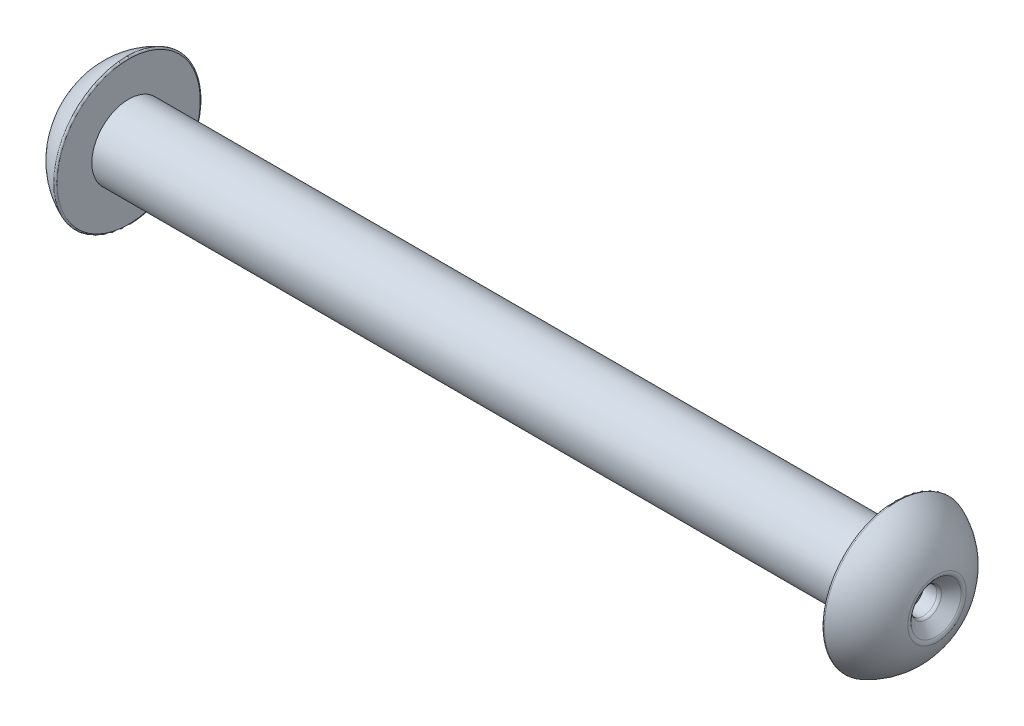
ISO-10303-21;
HEADER;
FILE_DESCRIPTION(('STEP AP214'),'2;1');
FILE_NAME('part.step','',(''),(''),'','','');
FILE_SCHEMA(('AUTOMOTIVE_DESIGN { 1 0 10303 214 1 1 1 1 }'));
ENDSEC;
DATA;
#1=APPLICATION_CONTEXT('core data for automotive mechanical design processes');
#2=APPLICATION_PROTOCOL_DEFINITION('international standard','automotive_design',2000,#1);
#3=PRODUCT_CONTEXT('',#1,'mechanical');
#4=PRODUCT('Part','Part','',(#3));
#5=PRODUCT_RELATED_PRODUCT_CATEGORY('part','',(#4));
#6=PRODUCT_DEFINITION_FORMATION('','',#4);
#7=PRODUCT_DEFINITION_CONTEXT('part definition',#1,'design');
#8=PRODUCT_DEFINITION('design','',#6,#7);
#9=PRODUCT_DEFINITION_SHAPE('','',#8);
#10=(LENGTH_UNIT() NAMED_UNIT(*) SI_UNIT(.MILLI.,.METRE.));
#11=(NAMED_UNIT(*) PLANE_ANGLE_UNIT() SI_UNIT($,.RADIAN.));
#12=(NAMED_UNIT(*) SI_UNIT($,.STERADIAN.) SOLID_ANGLE_UNIT());
#13=UNCERTAINTY_MEASURE_WITH_UNIT(LENGTH_MEASURE(1.E-05),#10,'distance_accuracy_value','');
#14=(GEOMETRIC_REPRESENTATION_CONTEXT(3) GLOBAL_UNCERTAINTY_ASSIGNED_CONTEXT((#13)) GLOBAL_UNIT_ASSIGNED_CONTEXT((#10,
#11,#12)) REPRESENTATION_CONTEXT('',''));
#15=CARTESIAN_POINT('',(0.,0.,0.));
#16=DIRECTION('',(0.,0.,1.));
#17=DIRECTION('',(1.,0.,0.));
#18=AXIS2_PLACEMENT_3D('',#15,#16,#17);
#19=CARTESIAN_POINT('',(1.5,0.,0.));
#20=DIRECTION('',(1.,0.,0.));
#21=DIRECTION('',(0.,0.,-1.));
#22=AXIS2_PLACEMENT_3D('',#19,#20,#21);
#23=DEGENERATE_TOROIDAL_SURFACE('',#22,0.757359312880715,4.5,.T.);
#24=CARTESIAN_POINT('',(-2.72723328863977,0.,0.));
#25=DIRECTION('',(1.,0.,0.));
#26=DIRECTION('',(0.,0.,-1.));
#27=AXIS2_PLACEMENT_3D('',#24,#25,#26);
#28=CIRCLE('',#27,2.30024580365565);
#29=CARTESIAN_POINT('',(-2.72723328863977,0.,-2.30024580365565));
#30=VERTEX_POINT('',#29);
#31=EDGE_CURVE('E53',#30,#30,#28,.T.);
#32=ORIENTED_EDGE('',*,*,#31,.T.);
#33=EDGE_LOOP('',(#32));
#34=FACE_BOUND('',#33,.T.);
#35=CARTESIAN_POINT('',(-0.136363636363636,0.,0.));
#36=DIRECTION('',(1.,0.,0.));
#37=DIRECTION('',(0.,0.,-1.));
#38=AXIS2_PLACEMENT_3D('',#35,#36,#37);
#39=CIRCLE('',#38,4.94929371713691);
#40=CARTESIAN_POINT('',(-0.136363636363636,0.,-4.94929371713691));
#41=VERTEX_POINT('',#40);
#42=EDGE_CURVE('E56',#41,#41,#39,.F.);
#43=ORIENTED_EDGE('',*,*,#42,.T.);
#44=EDGE_LOOP('',(#43));
#45=FACE_BOUND('',#44,.T.);
#46=ADVANCED_FACE('F39',(#34,#45),#23,.T.);
#47=CARTESIAN_POINT('',(52.,0.,0.));
#48=DIRECTION('',(-1.,0.,0.));
#49=DIRECTION('',(0.,0.,1.));
#50=AXIS2_PLACEMENT_3D('',#47,#48,#49);
#51=CYLINDRICAL_SURFACE('',#50,2.5);
#52=CARTESIAN_POINT('',(52.,0.,0.));
#53=DIRECTION('',(1.,0.,0.));
#54=DIRECTION('',(0.,0.,-1.));
#55=AXIS2_PLACEMENT_3D('',#52,#53,#54);
#56=CIRCLE('',#55,2.5);
#57=CARTESIAN_POINT('',(52.,0.,2.5));
#58=VERTEX_POINT('',#57);
#59=EDGE_CURVE('E84',#58,#58,#56,.T.);
#60=CARTESIAN_POINT('',(0.,0.,0.));
#61=DIRECTION('',(1.,0.,0.));
#62=DIRECTION('',(0.,0.,-1.));
#63=AXIS2_PLACEMENT_3D('',#60,#61,#62);
#64=CIRCLE('',#63,2.5);
#65=CARTESIAN_POINT('',(0.,0.,2.5));
#66=VERTEX_POINT('',#65);
#67=EDGE_CURVE('E81',#66,#66,#64,.T.);
#68=CARTESIAN_POINT('',(52.,0.,2.5));
#69=CARTESIAN_POINT('',(51.4583333333333,0.,2.5));
#70=CARTESIAN_POINT('',(50.9166666666667,0.,2.5));
#71=CARTESIAN_POINT('',(49.8333333333333,0.,2.5));
#72=CARTESIAN_POINT('',(49.2916666666667,0.,2.5));
#73=CARTESIAN_POINT('',(48.2083333333333,0.,2.5));
#74=CARTESIAN_POINT('',(47.6666666666667,0.,2.5));
#75=CARTESIAN_POINT('',(46.5833333333333,0.,2.5));
#76=CARTESIAN_POINT('',(46.0416666666667,0.,2.5));
#77=CARTESIAN_POINT('',(44.9583333333333,0.,2.5));
#78=CARTESIAN_POINT('',(44.4166666666667,0.,2.5));
#79=CARTESIAN_POINT('',(43.3333333333333,0.,2.5));
#80=CARTESIAN_POINT('',(42.7916666666667,0.,2.5));
#81=CARTESIAN_POINT('',(41.7083333333333,0.,2.5));
#82=CARTESIAN_POINT('',(41.1666666666667,0.,2.5));
#83=CARTESIAN_POINT('',(40.0833333333333,0.,2.5));
#84=CARTESIAN_POINT('',(39.5416666666667,0.,2.5));
#85=CARTESIAN_POINT('',(38.4583333333333,0.,2.5));
#86=CARTESIAN_POINT('',(37.9166666666667,0.,2.5));
#87=CARTESIAN_POINT('',(36.8333333333333,0.,2.5));
#88=CARTESIAN_POINT('',(36.2916666666667,0.,2.5));
#89=CARTESIAN_POINT('',(35.2083333333333,0.,2.5));
#90=CARTESIAN_POINT('',(34.6666666666667,0.,2.5));
#91=CARTESIAN_POINT('',(33.5833333333333,0.,2.5));
#92=CARTESIAN_POINT('',(33.0416666666667,0.,2.5));
#93=CARTESIAN_POINT('',(31.9583333333333,0.,2.5));
#94=CARTESIAN_POINT('',(31.4166666666667,0.,2.5));
#95=CARTESIAN_POINT('',(30.3333333333333,0.,2.5));
#96=CARTESIAN_POINT('',(29.7916666666667,0.,2.5));
#97=CARTESIAN_POINT('',(28.7083333333333,0.,2.5));
#98=CARTESIAN_POINT('',(28.1666666666667,0.,2.5));
#99=CARTESIAN_POINT('',(27.0833333333333,0.,2.5));
#100=CARTESIAN_POINT('',(26.5416666666667,0.,2.5));
#101=CARTESIAN_POINT('',(25.4583333333333,0.,2.5));
#102=CARTESIAN_POINT('',(24.9166666666667,0.,2.5));
#103=CARTESIAN_POINT('',(23.8333333333333,0.,2.5));
#104=CARTESIAN_POINT('',(23.2916666666667,0.,2.5));
#105=CARTESIAN_POINT('',(22.2083333333333,0.,2.5));
#106=CARTESIAN_POINT('',(21.6666666666667,0.,2.5));
#107=CARTESIAN_POINT('',(20.5833333333333,0.,2.5));
#108=CARTESIAN_POINT('',(20.0416666666667,0.,2.5));
#109=CARTESIAN_POINT('',(18.9583333333333,0.,2.5));
#110=CARTESIAN_POINT('',(18.4166666666667,0.,2.5));
#111=CARTESIAN_POINT('',(17.3333333333333,0.,2.5));
#112=CARTESIAN_POINT('',(16.7916666666667,0.,2.5));
#113=CARTESIAN_POINT('',(15.7083333333333,0.,2.5));
#114=CARTESIAN_POINT('',(15.1666666666667,0.,2.5));
#115=CARTESIAN_POINT('',(14.0833333333333,0.,2.5));
#116=CARTESIAN_POINT('',(13.5416666666667,0.,2.5));
#117=CARTESIAN_POINT('',(12.4583333333333,0.,2.5));
#118=CARTESIAN_POINT('',(11.9166666666667,0.,2.5));
#119=CARTESIAN_POINT('',(10.8333333333333,0.,2.5));
#120=CARTESIAN_POINT('',(10.2916666666667,0.,2.5));
#121=CARTESIAN_POINT('',(9.20833333333333,0.,2.5));
#122=CARTESIAN_POINT('',(8.66666666666667,0.,2.5));
#123=CARTESIAN_POINT('',(7.58333333333333,0.,2.5));
#124=CARTESIAN_POINT('',(7.04166666666667,0.,2.5));
#125=CARTESIAN_POINT('',(5.95833333333333,0.,2.5));
#126=CARTESIAN_POINT('',(5.41666666666667,0.,2.5));
#127=CARTESIAN_POINT('',(4.33333333333333,0.,2.5));
#128=CARTESIAN_POINT('',(3.79166666666667,0.,2.5));
#129=CARTESIAN_POINT('',(2.70833333333334,0.,2.5));
#130=CARTESIAN_POINT('',(2.16666666666667,0.,2.5));
#131=CARTESIAN_POINT('',(1.08333333333333,0.,2.5));
#132=CARTESIAN_POINT('',(0.541666666666667,0.,2.5));
#133=CARTESIAN_POINT('',(0.,0.,2.5));
#134=B_SPLINE_CURVE_WITH_KNOTS('',3,(#68,#69,#70,#71,#72,#73,#74,#75,#76,#77,#78,#79,#80,#81,
#82,#83,#84,#85,#86,#87,#88,#89,#90,#91,#92,#93,#94,#95,#96,#97,#98,#99,#100,#101,#102,#103,
#104,#105,#106,#107,#108,#109,#110,#111,#112,#113,#114,#115,#116,#117,#118,#119,#120,#121,#122,
#123,#124,#125,#126,#127,#128,#129,#130,#131,#132,#133),.UNSPECIFIED.,.F.,.F.,(4,2,2,2,2,2,2,2,
2,2,2,2,2,2,2,2,2,2,2,2,2,2,2,2,2,2,2,2,2,2,2,2,4),(0.,1.62499999999999,3.25,4.875,
6.49999999999999,8.12499999999999,9.74999999999999,11.375,13.,14.625,16.25,17.875,19.5,21.125,
22.75,24.375,26.,27.625,29.25,30.875,32.5,34.125,35.75,37.375,39.,40.625,42.25,43.875,45.5,
47.125,48.75,50.375,52.),.UNSPECIFIED.);
#135=EDGE_CURVE('BSEAM111',#58,#66,#134,.T.);
#136=ORIENTED_EDGE('',*,*,#59,.F.);
#137=ORIENTED_EDGE('',*,*,#67,.T.);
#138=ORIENTED_EDGE('',*,*,#135,.T.);
#139=ORIENTED_EDGE('',*,*,#135,.F.);
#140=EDGE_LOOP('',(#136,#138,#137,#139));
#141=FACE_BOUND('',#140,.T.);
#142=ADVANCED_FACE('F111',(#141),#51,.T.);
#143=CARTESIAN_POINT('',(52.,0.,0.));
#144=DIRECTION('',(1.,0.,0.));
#145=DIRECTION('',(0.,0.,-1.));
#146=AXIS2_PLACEMENT_3D('',#143,#144,#145);
#147=PLANE('',#146);
#148=CARTESIAN_POINT('',(52.,0.,0.));
#149=DIRECTION('',(1.,0.,0.));
#150=DIRECTION('',(0.,0.,-1.));
#151=AXIS2_PLACEMENT_3D('',#148,#149,#150);
#152=CIRCLE('',#151,4.85613961926455);
#153=CARTESIAN_POINT('',(52.,0.,-4.85613961926455));
#154=VERTEX_POINT('',#153);
#155=EDGE_CURVE('E80',#154,#154,#152,.F.);
#156=ORIENTED_EDGE('',*,*,#155,.T.);
#157=EDGE_LOOP('',(#156));
#158=FACE_BOUND('',#157,.T.);
#159=ORIENTED_EDGE('',*,*,#59,.T.);
#160=EDGE_LOOP('',(#159));
#161=FACE_BOUND('',#160,.T.);
#162=ADVANCED_FACE('F118',(#158,#161),#147,.F.);
#163=CARTESIAN_POINT('',(50.5,0.,0.));
#164=DIRECTION('',(-1.,0.,0.));
#165=DIRECTION('',(0.,0.,1.));
#166=AXIS2_PLACEMENT_3D('',#163,#164,#165);
#167=DEGENERATE_TOROIDAL_SURFACE('',#166,0.757359312880713,4.5,.T.);
#168=CARTESIAN_POINT('',(54.8297584046068,0.,0.));
#169=DIRECTION('',(-1.,0.,0.));
#170=DIRECTION('',(0.,0.,1.));
#171=AXIS2_PLACEMENT_3D('',#168,#169,#170);
#172=CIRCLE('',#171,1.98340668461504);
#173=CARTESIAN_POINT('',(54.8297584046068,0.,1.98340668461504));
#174=VERTEX_POINT('',#173);
#175=EDGE_CURVE('E72',#174,#174,#172,.T.);
#176=ORIENTED_EDGE('',*,*,#175,.T.);
#177=EDGE_LOOP('',(#176));
#178=FACE_BOUND('',#177,.T.);
#179=CARTESIAN_POINT('',(52.1363636363636,0.,0.));
#180=DIRECTION('',(-1.,0.,0.));
#181=DIRECTION('',(0.,0.,1.));
#182=AXIS2_PLACEMENT_3D('',#179,#180,#181);
#183=CIRCLE('',#182,4.94929371713691);
#184=CARTESIAN_POINT('',(52.1363636363636,0.,4.94929371713691));
#185=VERTEX_POINT('',#184);
#186=EDGE_CURVE('E78',#185,#185,#183,.F.);
#187=ORIENTED_EDGE('',*,*,#186,.T.);
#188=EDGE_LOOP('',(#187));
#189=FACE_BOUND('',#188,.T.);
#190=ADVANCED_FACE('F243',(#178,#189),#167,.T.);
#191=CARTESIAN_POINT('',(52.1,0.,0.));
#192=DIRECTION('',(1.,0.,0.));
#193=DIRECTION('',(0.,0.,-1.));
#194=AXIS2_PLACEMENT_3D('',#191,#192,#193);
#195=TOROIDAL_SURFACE('',#194,4.85613961926455,0.1);
#196=ORIENTED_EDGE('',*,*,#155,.F.);
#197=EDGE_LOOP('',(#196));
#198=FACE_BOUND('',#197,.T.);
#199=ORIENTED_EDGE('',*,*,#186,.F.);
#200=EDGE_LOOP('',(#199));
#201=FACE_BOUND('',#200,.T.);
#202=ADVANCED_FACE('F234',(#198,#201),#195,.T.);
#203=CARTESIAN_POINT('',(53.,0.,0.));
#204=DIRECTION('',(1.,0.,0.));
#205=DIRECTION('',(0.,0.,-1.));
#206=AXIS2_PLACEMENT_3D('',#203,#204,#205);
#207=CYLINDRICAL_SURFACE('',#206,0.914172605067906);
#208=CARTESIAN_POINT('',(53.8999389637669,0.,0.));
#209=DIRECTION('',(-1.,0.,0.));
#210=DIRECTION('',(0.,0.,1.));
#211=AXIS2_PLACEMENT_3D('',#208,#209,#210);
#212=CIRCLE('',#211,0.914172605067906);
#213=CARTESIAN_POINT('',(53.8999389637669,0.,0.914172605067906));
#214=VERTEX_POINT('',#213);
#215=EDGE_CURVE('E63',#214,#214,#212,.F.);
#216=ORIENTED_EDGE('',*,*,#215,.T.);
#217=EDGE_LOOP('',(#216));
#218=FACE_BOUND('',#217,.T.);
#219=CARTESIAN_POINT('',(53.,0.,0.));
#220=DIRECTION('',(1.,0.,0.));
#221=DIRECTION('',(0.,0.,-1.));
#222=AXIS2_PLACEMENT_3D('',#219,#220,#221);
#223=CIRCLE('',#222,0.914172605067906);
#224=CARTESIAN_POINT('',(53.,0.,-0.914172605067906));
#225=VERTEX_POINT('',#224);
#226=EDGE_CURVE('E90',#225,#225,#223,.T.);
#227=ORIENTED_EDGE('',*,*,#226,.F.);
#228=EDGE_LOOP('',(#227));
#229=FACE_BOUND('',#228,.T.);
#230=ADVANCED_FACE('F221',(#218,#229),#207,.F.);
#231=CARTESIAN_POINT('',(53.,0.,0.));
#232=DIRECTION('',(1.,0.,0.));
#233=DIRECTION('',(0.,0.,-1.));
#234=AXIS2_PLACEMENT_3D('',#231,#232,#233);
#235=PLANE('',#234);
#236=ORIENTED_EDGE('',*,*,#226,.T.);
#237=EDGE_LOOP('',(#236));
#238=FACE_BOUND('',#237,.T.);
#239=ADVANCED_FACE('F215',(#238),#235,.T.);
#240=CARTESIAN_POINT('',(54.0303733784655,0.,0.));
#241=DIRECTION('',(1.,0.,0.));
#242=DIRECTION('',(0.,0.,-1.));
#243=AXIS2_PLACEMENT_3D('',#240,#241,#242);
#244=CONICAL_SURFACE('',#243,0.914172605067906,0.820252618289772);
#245=CARTESIAN_POINT('',(54.7605032886848,0.,0.));
#246=DIRECTION('',(-1.,0.,0.));
#247=DIRECTION('',(0.,0.,1.));
#248=AXIS2_PLACEMENT_3D('',#245,#246,#247);
#249=CIRCLE('',#248,1.69705924775244);
#250=CARTESIAN_POINT('',(54.7605032886848,0.,1.69705924775244));
#251=VERTEX_POINT('',#250);
#252=EDGE_CURVE('E66',#251,#251,#249,.F.);
#253=ORIENTED_EDGE('',*,*,#252,.T.);
#254=EDGE_LOOP('',(#253));
#255=FACE_BOUND('',#254,.T.);
#256=CARTESIAN_POINT('',(54.119334408152,0.,0.));
#257=DIRECTION('',(1.,0.,0.));
#258=DIRECTION('',(0.,0.,-1.));
#259=AXIS2_PLACEMENT_3D('',#256,#257,#258);
#260=CIRCLE('',#259,1.00956165965425);
#261=CARTESIAN_POINT('',(54.119334408152,0.,-1.00956165965425));
#262=VERTEX_POINT('',#261);
#263=EDGE_CURVE('E73',#262,#262,#260,.F.);
#264=ORIENTED_EDGE('',*,*,#263,.T.);
#265=EDGE_LOOP('',(#264));
#266=FACE_BOUND('',#265,.T.);
#267=ADVANCED_FACE('F201',(#255,#266),#244,.F.);
#268=CARTESIAN_POINT('',(54.5411078442997,0.,0.));
#269=DIRECTION('',(1.,0.,0.));
#270=DIRECTION('',(0.,0.,-1.));
#271=AXIS2_PLACEMENT_3D('',#268,#269,#270);
#272=TOROIDAL_SURFACE('',#271,1.90167019316609,0.3);
#273=ORIENTED_EDGE('',*,*,#252,.F.);
#274=EDGE_LOOP('',(#273));
#275=FACE_BOUND('',#274,.T.);
#276=ORIENTED_EDGE('',*,*,#175,.F.);
#277=EDGE_LOOP('',(#276));
#278=FACE_BOUND('',#277,.T.);
#279=ADVANCED_FACE('F191',(#275,#278),#272,.T.);
#280=CARTESIAN_POINT('',(53.8999389637669,0.,0.));
#281=DIRECTION('',(-1.,0.,0.));
#282=DIRECTION('',(0.,0.,1.));
#283=AXIS2_PLACEMENT_3D('',#280,#281,#282);
#284=TOROIDAL_SURFACE('',#283,1.21417260506791,0.3);
#285=ORIENTED_EDGE('',*,*,#263,.F.);
#286=EDGE_LOOP('',(#285));
#287=FACE_BOUND('',#286,.T.);
#288=ORIENTED_EDGE('',*,*,#215,.F.);
#289=EDGE_LOOP('',(#288));
#290=FACE_BOUND('',#289,.T.);
#291=ADVANCED_FACE('F123',(#287,#290),#284,.T.);
#292=CARTESIAN_POINT('',(0.,0.,0.));
#293=DIRECTION('',(-1.,0.,0.));
#294=DIRECTION('',(0.,0.,-1.));
#295=AXIS2_PLACEMENT_3D('',#292,#293,#294);
#296=PLANE('',#295);
#297=CARTESIAN_POINT('',(0.,0.,0.));
#298=DIRECTION('',(-1.,0.,0.));
#299=DIRECTION('',(0.,0.,1.));
#300=AXIS2_PLACEMENT_3D('',#297,#298,#299);
#301=CIRCLE('',#300,4.85613961926455);
#302=CARTESIAN_POINT('',(0.,0.,4.85613961926455));
#303=VERTEX_POINT('',#302);
#304=EDGE_CURVE('E65',#303,#303,#301,.F.);
#305=ORIENTED_EDGE('',*,*,#304,.T.);
#306=EDGE_LOOP('',(#305));
#307=FACE_BOUND('',#306,.T.);
#308=ORIENTED_EDGE('',*,*,#67,.F.);
#309=EDGE_LOOP('',(#308));
#310=FACE_BOUND('',#309,.T.);
#311=ADVANCED_FACE('F129',(#307,#310),#296,.F.);
#312=CARTESIAN_POINT('',(-0.1,0.,0.));
#313=DIRECTION('',(-1.,0.,0.));
#314=DIRECTION('',(0.,0.,1.));
#315=AXIS2_PLACEMENT_3D('',#312,#313,#314);
#316=TOROIDAL_SURFACE('',#315,4.85613961926455,0.1);
#317=ORIENTED_EDGE('',*,*,#42,.F.);
#318=EDGE_LOOP('',(#317));
#319=FACE_BOUND('',#318,.T.);
#320=ORIENTED_EDGE('',*,*,#304,.F.);
#321=EDGE_LOOP('',(#320));
#322=FACE_BOUND('',#321,.T.);
#323=ADVANCED_FACE('F108',(#319,#322),#316,.T.);
#324=CARTESIAN_POINT('',(-1.,0.,0.));
#325=DIRECTION('',(-1.,0.,0.));
#326=DIRECTION('',(0.,0.,1.));
#327=AXIS2_PLACEMENT_3D('',#324,#325,#326);
#328=CYLINDRICAL_SURFACE('',#327,0.914172605067906);
#329=CARTESIAN_POINT('',(-1.7106304443659,0.,0.));
#330=DIRECTION('',(1.,0.,0.));
#331=DIRECTION('',(0.,0.,-1.));
#332=AXIS2_PLACEMENT_3D('',#329,#330,#331);
#333=CIRCLE('',#332,0.914172605067906);
#334=CARTESIAN_POINT('',(-1.7106304443659,0.,-0.914172605067906));
#335=VERTEX_POINT('',#334);
#336=EDGE_CURVE('E10',#335,#335,#333,.F.);
#337=ORIENTED_EDGE('',*,*,#336,.T.);
#338=EDGE_LOOP('',(#337));
#339=FACE_BOUND('',#338,.T.);
#340=CARTESIAN_POINT('',(-1.,0.,0.));
#341=DIRECTION('',(1.,0.,0.));
#342=DIRECTION('',(0.,0.,-1.));
#343=AXIS2_PLACEMENT_3D('',#340,#341,#342);
#344=CIRCLE('',#343,0.914172605067906);
#345=CARTESIAN_POINT('',(-1.,0.,-0.914172605067906));
#346=VERTEX_POINT('',#345);
#347=EDGE_CURVE('E86',#346,#346,#344,.T.);
#348=ORIENTED_EDGE('',*,*,#347,.T.);
#349=EDGE_LOOP('',(#348));
#350=FACE_BOUND('',#349,.T.);
#351=ADVANCED_FACE('F98',(#339,#350),#328,.F.);
#352=CARTESIAN_POINT('',(-1.,0.,0.));
#353=DIRECTION('',(-1.,0.,0.));
#354=DIRECTION('',(0.,0.,-1.));
#355=AXIS2_PLACEMENT_3D('',#352,#353,#354);
#356=PLANE('',#355);
#357=ORIENTED_EDGE('',*,*,#347,.F.);
#358=EDGE_LOOP('',(#357));
#359=FACE_BOUND('',#358,.T.);
#360=ADVANCED_FACE('F96',(#359),#356,.T.);
#361=CARTESIAN_POINT('',(-2.78073150993129,0.,0.));
#362=DIRECTION('',(-1.,0.,0.));
#363=DIRECTION('',(0.,0.,1.));
#364=AXIS2_PLACEMENT_3D('',#361,#362,#363);
#365=CONICAL_SURFACE('',#364,2.14492471309845,0.929004969900131);
#366=CARTESIAN_POINT('',(-2.68572514046548,0.,0.));
#367=DIRECTION('',(1.,0.,0.));
#368=DIRECTION('',(0.,0.,-1.));
#369=AXIS2_PLACEMENT_3D('',#366,#367,#368);
#370=CIRCLE('',#369,2.01779730761896);
#371=CARTESIAN_POINT('',(-2.68572514046548,0.,2.01779730761896));
#372=VERTEX_POINT('',#371);
#373=EDGE_CURVE('E46',#372,#372,#370,.F.);
#374=CARTESIAN_POINT('',(-1.95093784876759,0.,0.));
#375=DIRECTION('',(1.,0.,0.));
#376=DIRECTION('',(0.,0.,-1.));
#377=AXIS2_PLACEMENT_3D('',#374,#375,#376);
#378=CIRCLE('',#377,1.03458320841621);
#379=CARTESIAN_POINT('',(-1.95093784876759,0.,1.03458320841621));
#380=VERTEX_POINT('',#379);
#381=EDGE_CURVE('E49',#380,#380,#378,.T.);
#382=CARTESIAN_POINT('',(-2.68572514046548,0.,2.01779730761896));
#383=CARTESIAN_POINT('',(-2.67807110617696,0.,2.0075554940856));
#384=CARTESIAN_POINT('',(-2.67041707188844,0.,1.99731368055223));
#385=CARTESIAN_POINT('',(-2.6551090033114,0.,1.97683005348551));
#386=CARTESIAN_POINT('',(-2.64745496902288,0.,1.96658823995215));
#387=CARTESIAN_POINT('',(-2.63214690044584,0.,1.94610461288542));
#388=CARTESIAN_POINT('',(-2.62449286615732,0.,1.93586279935206));
#389=CARTESIAN_POINT('',(-2.60918479758028,0.,1.91537917228534));
#390=CARTESIAN_POINT('',(-2.60153076329176,0.,1.90513735875198));
#391=CARTESIAN_POINT('',(-2.58622269471472,0.,1.88465373168525));
#392=CARTESIAN_POINT('',(-2.5785686604262,0.,1.87441191815189));
#393=CARTESIAN_POINT('',(-2.56326059184916,0.,1.85392829108517));
#394=CARTESIAN_POINT('',(-2.55560655756064,0.,1.8436864775518));
#395=CARTESIAN_POINT('',(-2.5402984889836,0.,1.82320285048508));
#396=CARTESIAN_POINT('',(-2.53264445469508,0.,1.81296103695172));
#397=CARTESIAN_POINT('',(-2.51733638611804,0.,1.79247740988499));
#398=CARTESIAN_POINT('',(-2.50968235182952,0.,1.78223559635163));
#399=CARTESIAN_POINT('',(-2.49437428325249,0.,1.76175196928491));
#400=CARTESIAN_POINT('',(-2.48672024896397,0.,1.75151015575155));
#401=CARTESIAN_POINT('',(-2.47141218038693,0.,1.73102652868482));
#402=CARTESIAN_POINT('',(-2.46375814609841,0.,1.72078471515146));
#403=CARTESIAN_POINT('',(-2.44845007752137,0.,1.70030108808474));
#404=CARTESIAN_POINT('',(-2.44079604323285,0.,1.69005927455137));
#405=CARTESIAN_POINT('',(-2.42548797465581,0.,1.66957564748465));
#406=CARTESIAN_POINT('',(-2.41783394036729,0.,1.65933383395129));
#407=CARTESIAN_POINT('',(-2.40252587179025,0.,1.63885020688456));
#408=CARTESIAN_POINT('',(-2.39487183750173,0.,1.6286083933512));
#409=CARTESIAN_POINT('',(-2.37956376892469,0.,1.60812476628448));
#410=CARTESIAN_POINT('',(-2.37190973463617,0.,1.59788295275112));
#411=CARTESIAN_POINT('',(-2.35660166605913,0.,1.57739932568439));
#412=CARTESIAN_POINT('',(-2.34894763177061,0.,1.56715751215103));
#413=CARTESIAN_POINT('',(-2.33363956319357,0.,1.54667388508431));
#414=CARTESIAN_POINT('',(-2.32598552890505,0.,1.53643207155094));
#415=CARTESIAN_POINT('',(-2.31067746032801,0.,1.51594844448422));
#416=CARTESIAN_POINT('',(-2.30302342603949,0.,1.50570663095086));
#417=CARTESIAN_POINT('',(-2.28771535746245,0.,1.48522300388413));
#418=CARTESIAN_POINT('',(-2.28006132317394,0.,1.47498119035077));
#419=CARTESIAN_POINT('',(-2.2647532545969,0.,1.45449756328405));
#420=CARTESIAN_POINT('',(-2.25709922030838,0.,1.44425574975069));
#421=CARTESIAN_POINT('',(-2.24179115173134,0.,1.42377212268396));
#422=CARTESIAN_POINT('',(-2.23413711744282,0.,1.4135303091506));
#423=CARTESIAN_POINT('',(-2.21882904886578,0.,1.39304668208388));
#424=CARTESIAN_POINT('',(-2.21117501457726,0.,1.38280486855051));
#425=CARTESIAN_POINT('',(-2.19586694600022,0.,1.36232124148379));
#426=CARTESIAN_POINT('',(-2.1882129117117,0.,1.35207942795043));
#427=CARTESIAN_POINT('',(-2.17290484313466,0.,1.3315958008837));
#428=CARTESIAN_POINT('',(-2.16525080884614,0.,1.32135398735034));
#429=CARTESIAN_POINT('',(-2.1499427402691,0.,1.30087036028362));
#430=CARTESIAN_POINT('',(-2.14228870598058,0.,1.29062854675026));
#431=CARTESIAN_POINT('',(-2.12698063740354,0.,1.27014491968353));
#432=CARTESIAN_POINT('',(-2.11932660311502,0.,1.25990310615017));
#433=CARTESIAN_POINT('',(-2.10401853453798,0.,1.23941947908345));
#434=CARTESIAN_POINT('',(-2.09636450024946,0.,1.22917766555008));
#435=CARTESIAN_POINT('',(-2.08105643167242,0.,1.20869403848336));
#436=CARTESIAN_POINT('',(-2.0734023973839,0.,1.19845222495));
#437=CARTESIAN_POINT('',(-2.05809432880686,0.,1.17796859788327));
#438=CARTESIAN_POINT('',(-2.05044029451834,0.,1.16772678434991));
#439=CARTESIAN_POINT('',(-2.03513222594131,0.,1.14724315728319));
#440=CARTESIAN_POINT('',(-2.02747819165279,0.,1.13700134374983));
#441=CARTESIAN_POINT('',(-2.01217012307575,0.,1.1165177166831));
#442=CARTESIAN_POINT('',(-2.00451608878723,0.,1.10627590314974));
#443=CARTESIAN_POINT('',(-1.98920802021019,0.,1.08579227608302));
#444=CARTESIAN_POINT('',(-1.98155398592167,0.,1.07555046254965));
#445=CARTESIAN_POINT('',(-1.96624591734463,0.,1.05506683548293));
#446=CARTESIAN_POINT('',(-1.95859188305611,0.,1.04482502194957));
#447=CARTESIAN_POINT('',(-1.95093784876759,0.,1.03458320841621));
#448=B_SPLINE_CURVE_WITH_KNOTS('',3,(#382,#383,#384,#385,#386,#387,#388,#389,#390,#391,#392,
#393,#394,#395,#396,#397,#398,#399,#400,#401,#402,#403,#404,#405,#406,#407,#408,#409,#410,#411,
#412,#413,#414,#415,#416,#417,#418,#419,#420,#421,#422,#423,#424,#425,#426,#427,#428,#429,#430,
#431,#432,#433,#434,#435,#436,#437,#438,#439,#440,#441,#442,#443,#444,#445,#446,#447),
.UNSPECIFIED.,.F.,.F.,(4,2,2,2,2,2,2,2,2,2,2,2,2,2,2,2,2,2,2,2,2,2,2,2,2,2,2,2,2,2,2,2,4),(0.,
0.0383576702639499,0.0767153405279001,0.11507301079185,0.1534306810558,0.19178835131975,
0.230146021583701,0.268503691847651,0.306861362111601,0.345219032375551,0.383576702639501,
0.421934372903451,0.460292043167401,0.498649713431351,0.537007383695302,0.575365053959252,
0.613722724223202,0.652080394487152,0.690438064751102,0.728795735015052,0.767153405279002,
0.805511075542952,0.843868745806903,0.882226416070853,0.920584086334803,0.958941756598753,
0.997299426862703,1.03565709712665,1.0740147673906,1.11237243765455,1.1507301079185,
1.18908777818245,1.2274454484464),.UNSPECIFIED.);
#449=EDGE_CURVE('BSEAM99',#372,#380,#448,.T.);
#450=ORIENTED_EDGE('',*,*,#373,.T.);
#451=ORIENTED_EDGE('',*,*,#381,.T.);
#452=ORIENTED_EDGE('',*,*,#449,.T.);
#453=ORIENTED_EDGE('',*,*,#449,.F.);
#454=EDGE_LOOP('',(#450,#452,#451,#453));
#455=FACE_BOUND('',#454,.T.);
#456=ADVANCED_FACE('F99',(#455),#365,.F.);
#457=CARTESIAN_POINT('',(-2.44541773606378,0.,0.));
#458=DIRECTION('',(-1.,0.,0.));
#459=DIRECTION('',(0.,0.,1.));
#460=AXIS2_PLACEMENT_3D('',#457,#458,#459);
#461=TOROIDAL_SURFACE('',#460,2.19738670427066,0.3);
#462=ORIENTED_EDGE('',*,*,#373,.F.);
#463=EDGE_LOOP('',(#462));
#464=FACE_BOUND('',#463,.T.);
#465=ORIENTED_EDGE('',*,*,#31,.F.);
#466=EDGE_LOOP('',(#465));
#467=FACE_BOUND('',#466,.T.);
#468=ADVANCED_FACE('F106',(#464,#467),#461,.T.);
#469=CARTESIAN_POINT('',(-1.7106304443659,0.,0.));
#470=DIRECTION('',(1.,0.,0.));
#471=DIRECTION('',(0.,0.,-1.));
#472=AXIS2_PLACEMENT_3D('',#469,#470,#471);
#473=TOROIDAL_SURFACE('',#472,1.21417260506791,0.3);
#474=ORIENTED_EDGE('',*,*,#381,.F.);
#475=EDGE_LOOP('',(#474));
#476=FACE_BOUND('',#475,.T.);
#477=ORIENTED_EDGE('',*,*,#336,.F.);
#478=EDGE_LOOP('',(#477));
#479=FACE_BOUND('',#478,.T.);
#480=ADVANCED_FACE('F41',(#476,#479),#473,.T.);
#481=CLOSED_SHELL('',(#46,#142,#162,#190,#202,#230,#239,#267,#279,#291,#311,#323,#351,#360,#456,
#468,#480));
#482=MANIFOLD_SOLID_BREP('B2',#481);
#483=ADVANCED_BREP_SHAPE_REPRESENTATION('',(#18,#482),#14);
#484=SHAPE_DEFINITION_REPRESENTATION(#9,#483);
ENDSEC;
END-ISO-10303-21;
